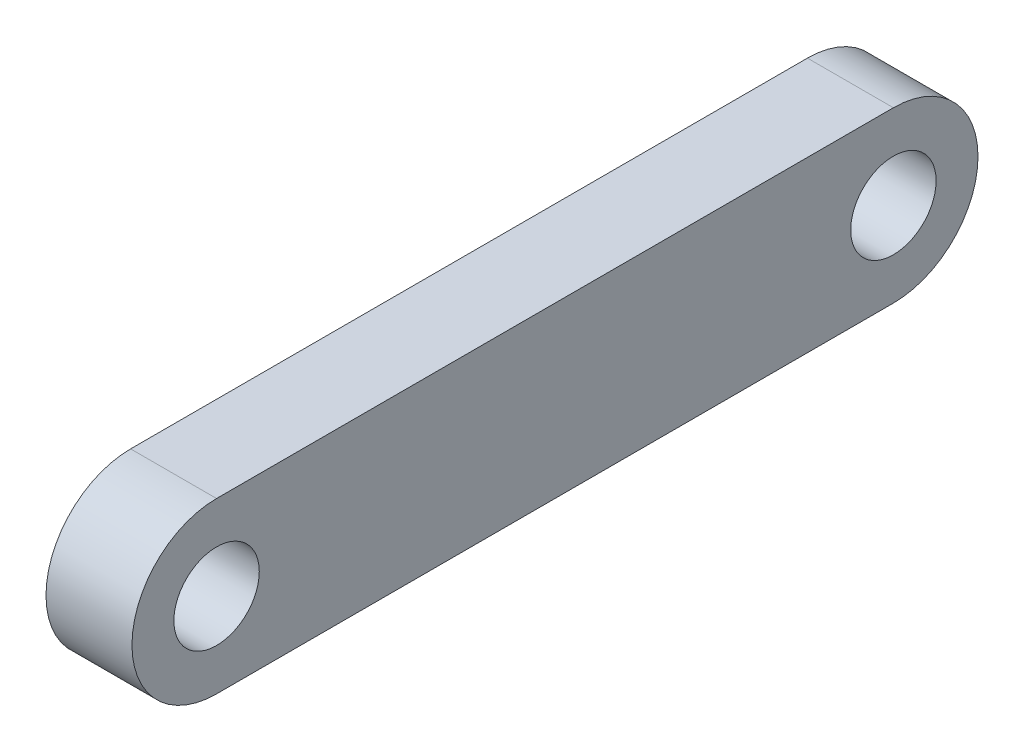
ISO-10303-21;
HEADER;
FILE_DESCRIPTION(('STEP AP214'),'2;1');
FILE_NAME('part.step','',(''),(''),'','','');
FILE_SCHEMA(('AUTOMOTIVE_DESIGN { 1 0 10303 214 1 1 1 1 }'));
ENDSEC;
DATA;
#1=APPLICATION_CONTEXT('core data for automotive mechanical design processes');
#2=APPLICATION_PROTOCOL_DEFINITION('international standard','automotive_design',2000,#1);
#3=PRODUCT_CONTEXT('',#1,'mechanical');
#4=PRODUCT('Part','Part','',(#3));
#5=PRODUCT_RELATED_PRODUCT_CATEGORY('part','',(#4));
#6=PRODUCT_DEFINITION_FORMATION('','',#4);
#7=PRODUCT_DEFINITION_CONTEXT('part definition',#1,'design');
#8=PRODUCT_DEFINITION('design','',#6,#7);
#9=PRODUCT_DEFINITION_SHAPE('','',#8);
#10=(LENGTH_UNIT() NAMED_UNIT(*) SI_UNIT(.MILLI.,.METRE.));
#11=(NAMED_UNIT(*) PLANE_ANGLE_UNIT() SI_UNIT($,.RADIAN.));
#12=(NAMED_UNIT(*) SI_UNIT($,.STERADIAN.) SOLID_ANGLE_UNIT());
#13=UNCERTAINTY_MEASURE_WITH_UNIT(LENGTH_MEASURE(1.E-05),#10,'distance_accuracy_value','');
#14=(GEOMETRIC_REPRESENTATION_CONTEXT(3) GLOBAL_UNCERTAINTY_ASSIGNED_CONTEXT((#13)) GLOBAL_UNIT_ASSIGNED_CONTEXT((#10,
#11,#12)) REPRESENTATION_CONTEXT('',''));
#15=CARTESIAN_POINT('',(0.,0.,0.));
#16=DIRECTION('',(0.,0.,1.));
#17=DIRECTION('',(1.,0.,0.));
#18=AXIS2_PLACEMENT_3D('',#15,#16,#17);
#19=CARTESIAN_POINT('',(4.064,0.,0.));
#20=DIRECTION('',(1.,0.,0.));
#21=DIRECTION('',(0.,0.,-1.));
#22=AXIS2_PLACEMENT_3D('',#19,#20,#21);
#23=PLANE('',#22);
#24=CARTESIAN_POINT('',(4.064,0.,0.));
#25=DIRECTION('',(1.,0.,0.));
#26=DIRECTION('',(0.,0.,-1.));
#27=AXIS2_PLACEMENT_3D('',#24,#25,#26);
#28=CIRCLE('',#27,2.0193);
#29=CARTESIAN_POINT('',(4.064,0.,-2.0193));
#30=VERTEX_POINT('',#29);
#31=EDGE_CURVE('E104',#30,#30,#28,.T.);
#32=ORIENTED_EDGE('',*,*,#31,.F.);
#33=EDGE_LOOP('',(#32));
#34=FACE_BOUND('',#33,.T.);
#35=CARTESIAN_POINT('',(4.064,0.,0.));
#36=DIRECTION('',(1.,0.,0.));
#37=DIRECTION('',(0.,0.,-1.));
#38=AXIS2_PLACEMENT_3D('',#35,#36,#37);
#39=CIRCLE('',#38,4.);
#40=CARTESIAN_POINT('',(4.064,4.,0.));
#41=VERTEX_POINT('',#40);
#42=CARTESIAN_POINT('',(4.064,-4.,0.));
#43=VERTEX_POINT('',#42);
#44=EDGE_CURVE('E89',#41,#43,#39,.T.);
#45=ORIENTED_EDGE('',*,*,#44,.T.);
#46=DIRECTION('',(0.,0.,-1.));
#47=VECTOR('',#46,1.);
#48=CARTESIAN_POINT('',(4.064,-4.,0.));
#49=LINE('',#48,#47);
#50=CARTESIAN_POINT('',(4.064,-4.,-32.));
#51=VERTEX_POINT('',#50);
#52=EDGE_CURVE('E84',#43,#51,#49,.T.);
#53=ORIENTED_EDGE('',*,*,#52,.T.);
#54=CARTESIAN_POINT('',(4.064,0.,-32.));
#55=DIRECTION('',(1.,0.,0.));
#56=DIRECTION('',(0.,0.,-1.));
#57=AXIS2_PLACEMENT_3D('',#54,#55,#56);
#58=CIRCLE('',#57,4.);
#59=CARTESIAN_POINT('',(4.064,4.,-32.));
#60=VERTEX_POINT('',#59);
#61=EDGE_CURVE('E87',#51,#60,#58,.T.);
#62=ORIENTED_EDGE('',*,*,#61,.T.);
#63=DIRECTION('',(0.,0.,1.));
#64=VECTOR('',#63,1.);
#65=CARTESIAN_POINT('',(4.064,4.,0.));
#66=LINE('',#65,#64);
#67=EDGE_CURVE('E54',#60,#41,#66,.T.);
#68=ORIENTED_EDGE('',*,*,#67,.T.);
#69=EDGE_LOOP('',(#45,#53,#62,#68));
#70=FACE_BOUND('',#69,.T.);
#71=CARTESIAN_POINT('',(4.064,0.,-32.));
#72=DIRECTION('',(1.,0.,0.));
#73=DIRECTION('',(0.,0.,-1.));
#74=AXIS2_PLACEMENT_3D('',#71,#72,#73);
#75=CIRCLE('',#74,2.0193);
#76=CARTESIAN_POINT('',(4.064,0.,-34.0193));
#77=VERTEX_POINT('',#76);
#78=EDGE_CURVE('E119',#77,#77,#75,.T.);
#79=ORIENTED_EDGE('',*,*,#78,.F.);
#80=EDGE_LOOP('',(#79));
#81=FACE_BOUND('',#80,.T.);
#82=ADVANCED_FACE('F37',(#34,#70,#81),#23,.T.);
#83=CARTESIAN_POINT('',(0.,0.,0.));
#84=DIRECTION('',(1.,0.,0.));
#85=DIRECTION('',(0.,0.,-1.));
#86=AXIS2_PLACEMENT_3D('',#83,#84,#85);
#87=PLANE('',#86);
#88=CARTESIAN_POINT('',(0.,0.,0.));
#89=DIRECTION('',(1.,0.,0.));
#90=DIRECTION('',(0.,0.,-1.));
#91=AXIS2_PLACEMENT_3D('',#88,#89,#90);
#92=CIRCLE('',#91,4.);
#93=CARTESIAN_POINT('',(0.,4.,0.));
#94=VERTEX_POINT('',#93);
#95=CARTESIAN_POINT('',(0.,-4.,0.));
#96=VERTEX_POINT('',#95);
#97=EDGE_CURVE('E101',#94,#96,#92,.T.);
#98=ORIENTED_EDGE('',*,*,#97,.F.);
#99=DIRECTION('',(0.,0.,1.));
#100=VECTOR('',#99,1.);
#101=CARTESIAN_POINT('',(0.,4.,0.));
#102=LINE('',#101,#100);
#103=CARTESIAN_POINT('',(0.,4.,-32.));
#104=VERTEX_POINT('',#103);
#105=EDGE_CURVE('E77',#104,#94,#102,.T.);
#106=ORIENTED_EDGE('',*,*,#105,.F.);
#107=CARTESIAN_POINT('',(0.,0.,-32.));
#108=DIRECTION('',(1.,0.,0.));
#109=DIRECTION('',(0.,0.,-1.));
#110=AXIS2_PLACEMENT_3D('',#107,#108,#109);
#111=CIRCLE('',#110,4.);
#112=CARTESIAN_POINT('',(0.,-4.,-32.));
#113=VERTEX_POINT('',#112);
#114=EDGE_CURVE('E71',#113,#104,#111,.T.);
#115=ORIENTED_EDGE('',*,*,#114,.F.);
#116=DIRECTION('',(0.,0.,-1.));
#117=VECTOR('',#116,1.);
#118=CARTESIAN_POINT('',(0.,-4.,0.));
#119=LINE('',#118,#117);
#120=EDGE_CURVE('E93',#96,#113,#119,.T.);
#121=ORIENTED_EDGE('',*,*,#120,.F.);
#122=EDGE_LOOP('',(#98,#106,#115,#121));
#123=FACE_BOUND('',#122,.T.);
#124=CARTESIAN_POINT('',(0.,0.,0.));
#125=DIRECTION('',(1.,0.,0.));
#126=DIRECTION('',(0.,0.,-1.));
#127=AXIS2_PLACEMENT_3D('',#124,#125,#126);
#128=CIRCLE('',#127,2.0193);
#129=CARTESIAN_POINT('',(0.,0.,-2.0193));
#130=VERTEX_POINT('',#129);
#131=EDGE_CURVE('E116',#130,#130,#128,.T.);
#132=ORIENTED_EDGE('',*,*,#131,.T.);
#133=EDGE_LOOP('',(#132));
#134=FACE_BOUND('',#133,.T.);
#135=CARTESIAN_POINT('',(0.,0.,-32.));
#136=DIRECTION('',(1.,0.,0.));
#137=DIRECTION('',(0.,0.,-1.));
#138=AXIS2_PLACEMENT_3D('',#135,#136,#137);
#139=CIRCLE('',#138,2.0193);
#140=CARTESIAN_POINT('',(0.,0.,-34.0193));
#141=VERTEX_POINT('',#140);
#142=EDGE_CURVE('E122',#141,#141,#139,.T.);
#143=ORIENTED_EDGE('',*,*,#142,.T.);
#144=EDGE_LOOP('',(#143));
#145=FACE_BOUND('',#144,.T.);
#146=ADVANCED_FACE('F112',(#123,#134,#145),#87,.F.);
#147=CARTESIAN_POINT('',(4.064,0.,0.));
#148=DIRECTION('',(-1.,0.,0.));
#149=DIRECTION('',(0.,0.,1.));
#150=AXIS2_PLACEMENT_3D('',#147,#148,#149);
#151=CYLINDRICAL_SURFACE('',#150,4.);
#152=ORIENTED_EDGE('',*,*,#97,.T.);
#153=DIRECTION('',(-1.,0.,0.));
#154=VECTOR('',#153,1.);
#155=CARTESIAN_POINT('',(4.064,-4.,0.));
#156=LINE('',#155,#154);
#157=EDGE_CURVE('E11',#43,#96,#156,.T.);
#158=ORIENTED_EDGE('',*,*,#157,.F.);
#159=ORIENTED_EDGE('',*,*,#44,.F.);
#160=DIRECTION('',(-1.,0.,0.));
#161=VECTOR('',#160,1.);
#162=CARTESIAN_POINT('',(4.064,4.,0.));
#163=LINE('',#162,#161);
#164=EDGE_CURVE('E97',#41,#94,#163,.T.);
#165=ORIENTED_EDGE('',*,*,#164,.T.);
#166=EDGE_LOOP('',(#152,#158,#159,#165));
#167=FACE_BOUND('',#166,.T.);
#168=ADVANCED_FACE('F39',(#167),#151,.T.);
#169=CARTESIAN_POINT('',(4.064,-4.,0.));
#170=DIRECTION('',(0.,1.,0.));
#171=DIRECTION('',(0.,0.,1.));
#172=AXIS2_PLACEMENT_3D('',#169,#170,#171);
#173=PLANE('',#172);
#174=ORIENTED_EDGE('',*,*,#120,.T.);
#175=DIRECTION('',(-1.,0.,0.));
#176=VECTOR('',#175,1.);
#177=CARTESIAN_POINT('',(4.064,-4.,-32.));
#178=LINE('',#177,#176);
#179=EDGE_CURVE('E46',#51,#113,#178,.T.);
#180=ORIENTED_EDGE('',*,*,#179,.F.);
#181=ORIENTED_EDGE('',*,*,#52,.F.);
#182=ORIENTED_EDGE('',*,*,#157,.T.);
#183=EDGE_LOOP('',(#174,#180,#181,#182));
#184=FACE_BOUND('',#183,.T.);
#185=ADVANCED_FACE('F92',(#184),#173,.F.);
#186=CARTESIAN_POINT('',(4.064,0.,-32.));
#187=DIRECTION('',(-1.,0.,0.));
#188=DIRECTION('',(0.,0.,1.));
#189=AXIS2_PLACEMENT_3D('',#186,#187,#188);
#190=CYLINDRICAL_SURFACE('',#189,4.);
#191=ORIENTED_EDGE('',*,*,#114,.T.);
#192=DIRECTION('',(-1.,0.,0.));
#193=VECTOR('',#192,1.);
#194=CARTESIAN_POINT('',(4.064,4.,-32.));
#195=LINE('',#194,#193);
#196=EDGE_CURVE('E94',#60,#104,#195,.T.);
#197=ORIENTED_EDGE('',*,*,#196,.F.);
#198=ORIENTED_EDGE('',*,*,#61,.F.);
#199=ORIENTED_EDGE('',*,*,#179,.T.);
#200=EDGE_LOOP('',(#191,#197,#198,#199));
#201=FACE_BOUND('',#200,.T.);
#202=ADVANCED_FACE('F95',(#201),#190,.T.);
#203=CARTESIAN_POINT('',(4.064,4.,0.));
#204=DIRECTION('',(0.,-1.,0.));
#205=DIRECTION('',(0.,0.,-1.));
#206=AXIS2_PLACEMENT_3D('',#203,#204,#205);
#207=PLANE('',#206);
#208=ORIENTED_EDGE('',*,*,#105,.T.);
#209=ORIENTED_EDGE('',*,*,#164,.F.);
#210=ORIENTED_EDGE('',*,*,#67,.F.);
#211=ORIENTED_EDGE('',*,*,#196,.T.);
#212=EDGE_LOOP('',(#208,#209,#210,#211));
#213=FACE_BOUND('',#212,.T.);
#214=ADVANCED_FACE('F109',(#213),#207,.F.);
#215=CARTESIAN_POINT('',(4.064,0.,0.));
#216=DIRECTION('',(-1.,0.,0.));
#217=DIRECTION('',(0.,0.,1.));
#218=AXIS2_PLACEMENT_3D('',#215,#216,#217);
#219=CYLINDRICAL_SURFACE('',#218,2.0193);
#220=ORIENTED_EDGE('',*,*,#31,.T.);
#221=EDGE_LOOP('',(#220));
#222=FACE_BOUND('',#221,.T.);
#223=ORIENTED_EDGE('',*,*,#131,.F.);
#224=EDGE_LOOP('',(#223));
#225=FACE_BOUND('',#224,.T.);
#226=ADVANCED_FACE('F139',(#222,#225),#219,.F.);
#227=CARTESIAN_POINT('',(4.064,0.,-32.));
#228=DIRECTION('',(-1.,0.,0.));
#229=DIRECTION('',(0.,0.,1.));
#230=AXIS2_PLACEMENT_3D('',#227,#228,#229);
#231=CYLINDRICAL_SURFACE('',#230,2.0193);
#232=ORIENTED_EDGE('',*,*,#78,.T.);
#233=EDGE_LOOP('',(#232));
#234=FACE_BOUND('',#233,.T.);
#235=ORIENTED_EDGE('',*,*,#142,.F.);
#236=EDGE_LOOP('',(#235));
#237=FACE_BOUND('',#236,.T.);
#238=ADVANCED_FACE('F128',(#234,#237),#231,.F.);
#239=CLOSED_SHELL('',(#82,#146,#168,#185,#202,#214,#226,#238));
#240=MANIFOLD_SOLID_BREP('B2',#239);
#241=ADVANCED_BREP_SHAPE_REPRESENTATION('',(#18,#240),#14);
#242=SHAPE_DEFINITION_REPRESENTATION(#9,#241);
ENDSEC;
END-ISO-10303-21;
